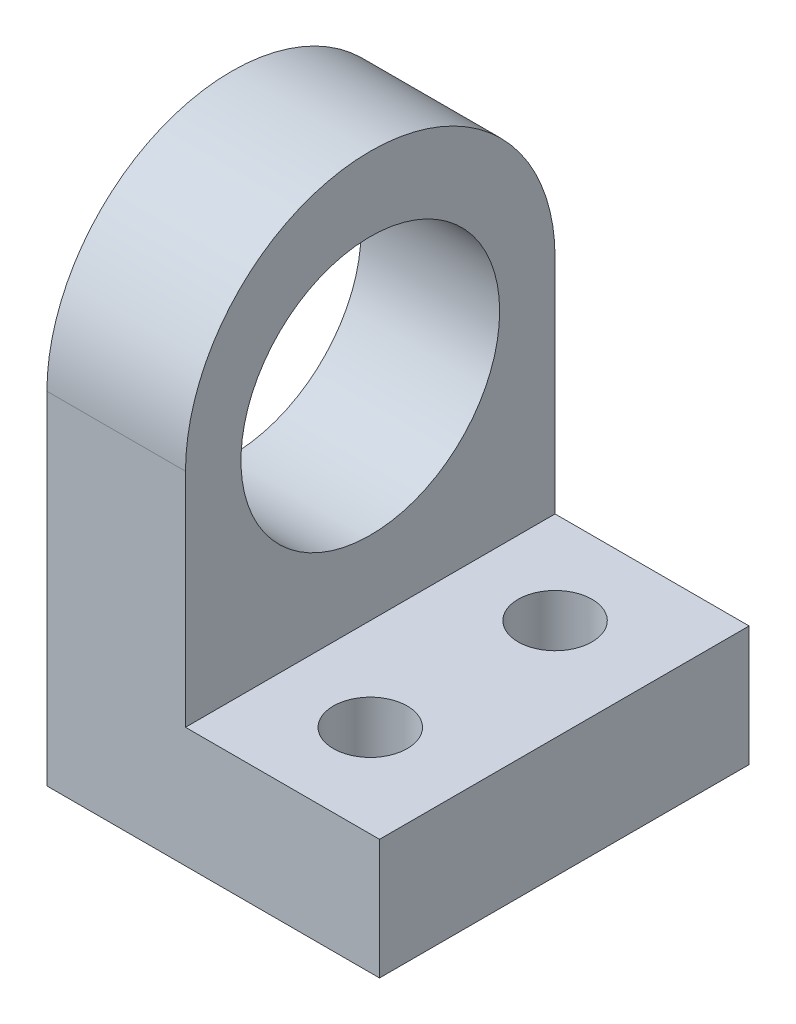
ISO-10303-21;
HEADER;
FILE_DESCRIPTION(('STEP AP214'),'2;1');
FILE_NAME('part.step','',(''),(''),'','','');
FILE_SCHEMA(('AUTOMOTIVE_DESIGN { 1 0 10303 214 1 1 1 1 }'));
ENDSEC;
DATA;
#1=APPLICATION_CONTEXT('core data for automotive mechanical design processes');
#2=APPLICATION_PROTOCOL_DEFINITION('international standard','automotive_design',2000,#1);
#3=PRODUCT_CONTEXT('',#1,'mechanical');
#4=PRODUCT('Part','Part','',(#3));
#5=PRODUCT_RELATED_PRODUCT_CATEGORY('part','',(#4));
#6=PRODUCT_DEFINITION_FORMATION('','',#4);
#7=PRODUCT_DEFINITION_CONTEXT('part definition',#1,'design');
#8=PRODUCT_DEFINITION('design','',#6,#7);
#9=PRODUCT_DEFINITION_SHAPE('','',#8);
#10=(LENGTH_UNIT() NAMED_UNIT(*) SI_UNIT(.MILLI.,.METRE.));
#11=(NAMED_UNIT(*) PLANE_ANGLE_UNIT() SI_UNIT($,.RADIAN.));
#12=(NAMED_UNIT(*) SI_UNIT($,.STERADIAN.) SOLID_ANGLE_UNIT());
#13=UNCERTAINTY_MEASURE_WITH_UNIT(LENGTH_MEASURE(1.E-05),#10,'distance_accuracy_value','');
#14=(GEOMETRIC_REPRESENTATION_CONTEXT(3) GLOBAL_UNCERTAINTY_ASSIGNED_CONTEXT((#13)) GLOBAL_UNIT_ASSIGNED_CONTEXT((#10,
#11,#12)) REPRESENTATION_CONTEXT('',''));
#15=CARTESIAN_POINT('',(0.,0.,0.));
#16=DIRECTION('',(0.,0.,1.));
#17=DIRECTION('',(1.,0.,0.));
#18=AXIS2_PLACEMENT_3D('',#15,#16,#17);
#19=CARTESIAN_POINT('',(-21.,24.,20.));
#20=DIRECTION('',(-1.,0.,0.));
#21=DIRECTION('',(0.,0.,1.));
#22=AXIS2_PLACEMENT_3D('',#19,#20,#21);
#23=CYLINDRICAL_SURFACE('',#22,20.);
#24=DIRECTION('',(1.,0.,0.));
#25=VECTOR('',#24,1.);
#26=CARTESIAN_POINT('',(-21.,24.,40.));
#27=LINE('',#26,#25);
#28=CARTESIAN_POINT('',(-21.,24.,40.));
#29=VERTEX_POINT('',#28);
#30=CARTESIAN_POINT('',(-36.,24.,40.));
#31=VERTEX_POINT('',#30);
#32=EDGE_CURVE('E112',#29,#31,#27,.F.);
#33=ORIENTED_EDGE('',*,*,#32,.F.);
#34=CARTESIAN_POINT('',(-21.,24.,20.));
#35=DIRECTION('',(-1.,0.,0.));
#36=DIRECTION('',(0.,0.,1.));
#37=AXIS2_PLACEMENT_3D('',#34,#35,#36);
#38=CIRCLE('',#37,20.);
#39=CARTESIAN_POINT('',(-21.,24.,0.));
#40=VERTEX_POINT('',#39);
#41=EDGE_CURVE('E44',#40,#29,#38,.F.);
#42=ORIENTED_EDGE('',*,*,#41,.F.);
#43=DIRECTION('',(-1.,0.,0.));
#44=VECTOR('',#43,1.);
#45=CARTESIAN_POINT('',(0.,24.,0.));
#46=LINE('',#45,#44);
#47=CARTESIAN_POINT('',(-36.,24.,0.));
#48=VERTEX_POINT('',#47);
#49=EDGE_CURVE('E114',#48,#40,#46,.F.);
#50=ORIENTED_EDGE('',*,*,#49,.F.);
#51=CARTESIAN_POINT('',(-36.,24.,20.));
#52=DIRECTION('',(1.,0.,0.));
#53=DIRECTION('',(0.,1.,0.));
#54=AXIS2_PLACEMENT_3D('',#51,#52,#53);
#55=CIRCLE('',#54,20.);
#56=EDGE_CURVE('E11',#31,#48,#55,.F.);
#57=ORIENTED_EDGE('',*,*,#56,.F.);
#58=EDGE_LOOP('',(#33,#42,#50,#57));
#59=FACE_BOUND('',#58,.T.);
#60=ADVANCED_FACE('F35',(#59),#23,.T.);
#61=CARTESIAN_POINT('',(-36.,-13.,40.));
#62=DIRECTION('',(0.,1.,0.));
#63=DIRECTION('',(0.,0.,1.));
#64=AXIS2_PLACEMENT_3D('',#61,#62,#63);
#65=PLANE('',#64);
#66=CARTESIAN_POINT('',(-11.,-13.,10.));
#67=DIRECTION('',(0.,1.,0.));
#68=DIRECTION('',(0.,0.,1.));
#69=AXIS2_PLACEMENT_3D('',#66,#67,#68);
#70=CIRCLE('',#69,4.);
#71=CARTESIAN_POINT('',(-11.,-13.,14.));
#72=VERTEX_POINT('',#71);
#73=EDGE_CURVE('E191',#72,#72,#70,.T.);
#74=ORIENTED_EDGE('',*,*,#73,.T.);
#75=EDGE_LOOP('',(#74));
#76=FACE_BOUND('',#75,.T.);
#77=CARTESIAN_POINT('',(-11.,-13.,30.));
#78=DIRECTION('',(0.,1.,0.));
#79=DIRECTION('',(0.,0.,1.));
#80=AXIS2_PLACEMENT_3D('',#77,#78,#79);
#81=CIRCLE('',#80,4.);
#82=CARTESIAN_POINT('',(-11.,-13.,34.));
#83=VERTEX_POINT('',#82);
#84=EDGE_CURVE('E186',#83,#83,#81,.T.);
#85=ORIENTED_EDGE('',*,*,#84,.T.);
#86=EDGE_LOOP('',(#85));
#87=FACE_BOUND('',#86,.T.);
#88=DIRECTION('',(1.,0.,0.));
#89=VECTOR('',#88,1.);
#90=CARTESIAN_POINT('',(-36.,-13.,0.));
#91=LINE('',#90,#89);
#92=CARTESIAN_POINT('',(-36.,-13.,0.));
#93=VERTEX_POINT('',#92);
#94=CARTESIAN_POINT('',(0.,-13.,0.));
#95=VERTEX_POINT('',#94);
#96=EDGE_CURVE('E111',#93,#95,#91,.T.);
#97=ORIENTED_EDGE('',*,*,#96,.T.);
#98=DIRECTION('',(0.,0.,-1.));
#99=VECTOR('',#98,1.);
#100=CARTESIAN_POINT('',(0.,-13.,40.));
#101=LINE('',#100,#99);
#102=CARTESIAN_POINT('',(0.,-13.,40.));
#103=VERTEX_POINT('',#102);
#104=EDGE_CURVE('E90',#103,#95,#101,.T.);
#105=ORIENTED_EDGE('',*,*,#104,.F.);
#106=DIRECTION('',(1.,0.,0.));
#107=VECTOR('',#106,1.);
#108=CARTESIAN_POINT('',(-36.,-13.,40.));
#109=LINE('',#108,#107);
#110=CARTESIAN_POINT('',(-36.,-13.,40.));
#111=VERTEX_POINT('',#110);
#112=EDGE_CURVE('E97',#111,#103,#109,.T.);
#113=ORIENTED_EDGE('',*,*,#112,.F.);
#114=DIRECTION('',(0.,0.,-1.));
#115=VECTOR('',#114,1.);
#116=CARTESIAN_POINT('',(-36.,-13.,40.));
#117=LINE('',#116,#115);
#118=EDGE_CURVE('E131',#111,#93,#117,.T.);
#119=ORIENTED_EDGE('',*,*,#118,.T.);
#120=EDGE_LOOP('',(#97,#105,#113,#119));
#121=FACE_BOUND('',#120,.T.);
#122=ADVANCED_FACE('F109',(#76,#87,#121),#65,.F.);
#123=CARTESIAN_POINT('',(0.,-13.,40.));
#124=DIRECTION('',(-1.,0.,0.));
#125=DIRECTION('',(0.,0.,1.));
#126=AXIS2_PLACEMENT_3D('',#123,#124,#125);
#127=PLANE('',#126);
#128=DIRECTION('',(0.,1.,0.));
#129=VECTOR('',#128,1.);
#130=CARTESIAN_POINT('',(0.,-13.,0.));
#131=LINE('',#130,#129);
#132=CARTESIAN_POINT('',(0.,0.,0.));
#133=VERTEX_POINT('',#132);
#134=EDGE_CURVE('E136',#95,#133,#131,.T.);
#135=ORIENTED_EDGE('',*,*,#134,.T.);
#136=DIRECTION('',(0.,0.,-1.));
#137=VECTOR('',#136,1.);
#138=CARTESIAN_POINT('',(0.,0.,40.));
#139=LINE('',#138,#137);
#140=CARTESIAN_POINT('',(0.,0.,40.));
#141=VERTEX_POINT('',#140);
#142=EDGE_CURVE('E93',#141,#133,#139,.T.);
#143=ORIENTED_EDGE('',*,*,#142,.F.);
#144=DIRECTION('',(0.,1.,0.));
#145=VECTOR('',#144,1.);
#146=CARTESIAN_POINT('',(0.,-13.,40.));
#147=LINE('',#146,#145);
#148=EDGE_CURVE('E86',#103,#141,#147,.T.);
#149=ORIENTED_EDGE('',*,*,#148,.F.);
#150=ORIENTED_EDGE('',*,*,#104,.T.);
#151=EDGE_LOOP('',(#135,#143,#149,#150));
#152=FACE_BOUND('',#151,.T.);
#153=ADVANCED_FACE('F88',(#152),#127,.F.);
#154=CARTESIAN_POINT('',(0.,0.,40.));
#155=DIRECTION('',(0.,-1.,0.));
#156=DIRECTION('',(1.,0.,0.));
#157=AXIS2_PLACEMENT_3D('',#154,#155,#156);
#158=PLANE('',#157);
#159=CARTESIAN_POINT('',(-11.,0.,10.));
#160=DIRECTION('',(0.,1.,0.));
#161=DIRECTION('',(-1.,0.,0.));
#162=AXIS2_PLACEMENT_3D('',#159,#160,#161);
#163=CIRCLE('',#162,4.);
#164=CARTESIAN_POINT('',(-15.,0.,10.));
#165=VERTEX_POINT('',#164);
#166=EDGE_CURVE('E180',#165,#165,#163,.T.);
#167=ORIENTED_EDGE('',*,*,#166,.F.);
#168=EDGE_LOOP('',(#167));
#169=FACE_BOUND('',#168,.T.);
#170=CARTESIAN_POINT('',(-11.,0.,30.));
#171=DIRECTION('',(0.,1.,0.));
#172=DIRECTION('',(-1.,0.,0.));
#173=AXIS2_PLACEMENT_3D('',#170,#171,#172);
#174=CIRCLE('',#173,4.);
#175=CARTESIAN_POINT('',(-15.,0.,30.));
#176=VERTEX_POINT('',#175);
#177=EDGE_CURVE('E183',#176,#176,#174,.T.);
#178=ORIENTED_EDGE('',*,*,#177,.F.);
#179=EDGE_LOOP('',(#178));
#180=FACE_BOUND('',#179,.T.);
#181=DIRECTION('',(-1.,0.,0.));
#182=VECTOR('',#181,1.);
#183=CARTESIAN_POINT('',(0.,0.,0.));
#184=LINE('',#183,#182);
#185=CARTESIAN_POINT('',(-21.,0.,0.));
#186=VERTEX_POINT('',#185);
#187=EDGE_CURVE('E138',#133,#186,#184,.T.);
#188=ORIENTED_EDGE('',*,*,#187,.T.);
#189=DIRECTION('',(0.,0.,-1.));
#190=VECTOR('',#189,1.);
#191=CARTESIAN_POINT('',(-21.,0.,40.));
#192=LINE('',#191,#190);
#193=CARTESIAN_POINT('',(-21.,0.,40.));
#194=VERTEX_POINT('',#193);
#195=EDGE_CURVE('E116',#194,#186,#192,.T.);
#196=ORIENTED_EDGE('',*,*,#195,.F.);
#197=DIRECTION('',(-1.,0.,0.));
#198=VECTOR('',#197,1.);
#199=CARTESIAN_POINT('',(0.,0.,40.));
#200=LINE('',#199,#198);
#201=EDGE_CURVE('E96',#141,#194,#200,.T.);
#202=ORIENTED_EDGE('',*,*,#201,.F.);
#203=ORIENTED_EDGE('',*,*,#142,.T.);
#204=EDGE_LOOP('',(#188,#196,#202,#203));
#205=FACE_BOUND('',#204,.T.);
#206=ADVANCED_FACE('F156',(#169,#180,#205),#158,.F.);
#207=CARTESIAN_POINT('',(-21.,0.,40.));
#208=DIRECTION('',(-1.,0.,0.));
#209=DIRECTION('',(0.,0.,1.));
#210=AXIS2_PLACEMENT_3D('',#207,#208,#209);
#211=PLANE('',#210);
#212=CARTESIAN_POINT('',(-21.,22.,20.));
#213=DIRECTION('',(1.,0.,0.));
#214=DIRECTION('',(0.,0.,-1.));
#215=AXIS2_PLACEMENT_3D('',#212,#213,#214);
#216=CIRCLE('',#215,14.);
#217=CARTESIAN_POINT('',(-21.,22.,6.));
#218=VERTEX_POINT('',#217);
#219=EDGE_CURVE('E193',#218,#218,#216,.T.);
#220=ORIENTED_EDGE('',*,*,#219,.F.);
#221=EDGE_LOOP('',(#220));
#222=FACE_BOUND('',#221,.T.);
#223=DIRECTION('',(0.,1.,0.));
#224=VECTOR('',#223,1.);
#225=CARTESIAN_POINT('',(-21.,0.,0.));
#226=LINE('',#225,#224);
#227=EDGE_CURVE('E128',#186,#40,#226,.T.);
#228=ORIENTED_EDGE('',*,*,#227,.T.);
#229=ORIENTED_EDGE('',*,*,#41,.T.);
#230=DIRECTION('',(0.,1.,0.));
#231=VECTOR('',#230,1.);
#232=CARTESIAN_POINT('',(-21.,0.,40.));
#233=LINE('',#232,#231);
#234=EDGE_CURVE('E126',#194,#29,#233,.T.);
#235=ORIENTED_EDGE('',*,*,#234,.F.);
#236=ORIENTED_EDGE('',*,*,#195,.T.);
#237=EDGE_LOOP('',(#228,#229,#235,#236));
#238=FACE_BOUND('',#237,.T.);
#239=ADVANCED_FACE('F124',(#222,#238),#211,.F.);
#240=CARTESIAN_POINT('',(-36.,44.,40.));
#241=DIRECTION('',(1.,0.,0.));
#242=DIRECTION('',(0.,1.,0.));
#243=AXIS2_PLACEMENT_3D('',#240,#241,#242);
#244=PLANE('',#243);
#245=CARTESIAN_POINT('',(-36.,22.,20.));
#246=DIRECTION('',(1.,0.,0.));
#247=DIRECTION('',(0.,1.,0.));
#248=AXIS2_PLACEMENT_3D('',#245,#246,#247);
#249=CIRCLE('',#248,14.);
#250=CARTESIAN_POINT('',(-36.,36.,20.));
#251=VERTEX_POINT('',#250);
#252=EDGE_CURVE('E39',#251,#251,#249,.T.);
#253=ORIENTED_EDGE('',*,*,#252,.T.);
#254=EDGE_LOOP('',(#253));
#255=FACE_BOUND('',#254,.T.);
#256=DIRECTION('',(0.,-1.,0.));
#257=VECTOR('',#256,1.);
#258=CARTESIAN_POINT('',(-36.,44.,40.));
#259=LINE('',#258,#257);
#260=EDGE_CURVE('E103',#31,#111,#259,.T.);
#261=ORIENTED_EDGE('',*,*,#260,.F.);
#262=ORIENTED_EDGE('',*,*,#56,.T.);
#263=DIRECTION('',(0.,-1.,0.));
#264=VECTOR('',#263,1.);
#265=CARTESIAN_POINT('',(-36.,44.,0.));
#266=LINE('',#265,#264);
#267=EDGE_CURVE('E107',#48,#93,#266,.T.);
#268=ORIENTED_EDGE('',*,*,#267,.T.);
#269=ORIENTED_EDGE('',*,*,#118,.F.);
#270=EDGE_LOOP('',(#261,#262,#268,#269));
#271=FACE_BOUND('',#270,.T.);
#272=ADVANCED_FACE('F147',(#255,#271),#244,.F.);
#273=CARTESIAN_POINT('',(0.,0.,40.));
#274=DIRECTION('',(0.,0.,1.));
#275=DIRECTION('',(1.,0.,0.));
#276=AXIS2_PLACEMENT_3D('',#273,#274,#275);
#277=PLANE('',#276);
#278=ORIENTED_EDGE('',*,*,#234,.T.);
#279=ORIENTED_EDGE('',*,*,#32,.T.);
#280=ORIENTED_EDGE('',*,*,#260,.T.);
#281=ORIENTED_EDGE('',*,*,#112,.T.);
#282=ORIENTED_EDGE('',*,*,#148,.T.);
#283=ORIENTED_EDGE('',*,*,#201,.T.);
#284=EDGE_LOOP('',(#278,#279,#280,#281,#282,#283));
#285=FACE_BOUND('',#284,.T.);
#286=ADVANCED_FACE('F101',(#285),#277,.T.);
#287=CARTESIAN_POINT('',(0.,0.,0.));
#288=DIRECTION('',(0.,0.,1.));
#289=DIRECTION('',(1.,0.,0.));
#290=AXIS2_PLACEMENT_3D('',#287,#288,#289);
#291=PLANE('',#290);
#292=ORIENTED_EDGE('',*,*,#267,.F.);
#293=ORIENTED_EDGE('',*,*,#49,.T.);
#294=ORIENTED_EDGE('',*,*,#227,.F.);
#295=ORIENTED_EDGE('',*,*,#187,.F.);
#296=ORIENTED_EDGE('',*,*,#134,.F.);
#297=ORIENTED_EDGE('',*,*,#96,.F.);
#298=EDGE_LOOP('',(#292,#293,#294,#295,#296,#297));
#299=FACE_BOUND('',#298,.T.);
#300=ADVANCED_FACE('F146',(#299),#291,.F.);
#301=CARTESIAN_POINT('',(-61.,22.,20.));
#302=DIRECTION('',(1.,0.,0.));
#303=DIRECTION('',(0.,0.,-1.));
#304=AXIS2_PLACEMENT_3D('',#301,#302,#303);
#305=CYLINDRICAL_SURFACE('',#304,14.);
#306=ORIENTED_EDGE('',*,*,#219,.T.);
#307=EDGE_LOOP('',(#306));
#308=FACE_BOUND('',#307,.T.);
#309=ORIENTED_EDGE('',*,*,#252,.F.);
#310=EDGE_LOOP('',(#309));
#311=FACE_BOUND('',#310,.T.);
#312=ADVANCED_FACE('F199',(#308,#311),#305,.F.);
#313=CARTESIAN_POINT('',(-11.,-40.,30.));
#314=DIRECTION('',(0.,1.,0.));
#315=DIRECTION('',(-1.,0.,0.));
#316=AXIS2_PLACEMENT_3D('',#313,#314,#315);
#317=CYLINDRICAL_SURFACE('',#316,4.);
#318=ORIENTED_EDGE('',*,*,#177,.T.);
#319=EDGE_LOOP('',(#318));
#320=FACE_BOUND('',#319,.T.);
#321=ORIENTED_EDGE('',*,*,#84,.F.);
#322=EDGE_LOOP('',(#321));
#323=FACE_BOUND('',#322,.T.);
#324=ADVANCED_FACE('F201',(#320,#323),#317,.F.);
#325=CARTESIAN_POINT('',(-11.,-40.,10.));
#326=DIRECTION('',(0.,1.,0.));
#327=DIRECTION('',(-1.,0.,0.));
#328=AXIS2_PLACEMENT_3D('',#325,#326,#327);
#329=CYLINDRICAL_SURFACE('',#328,4.);
#330=ORIENTED_EDGE('',*,*,#166,.T.);
#331=EDGE_LOOP('',(#330));
#332=FACE_BOUND('',#331,.T.);
#333=ORIENTED_EDGE('',*,*,#73,.F.);
#334=EDGE_LOOP('',(#333));
#335=FACE_BOUND('',#334,.T.);
#336=ADVANCED_FACE('F207',(#332,#335),#329,.F.);
#337=CLOSED_SHELL('',(#60,#122,#153,#206,#239,#272,#286,#300,#312,#324,#336));
#338=MANIFOLD_SOLID_BREP('B2',#337);
#339=ADVANCED_BREP_SHAPE_REPRESENTATION('',(#18,#338),#14);
#340=SHAPE_DEFINITION_REPRESENTATION(#9,#339);
ENDSEC;
END-ISO-10303-21;
